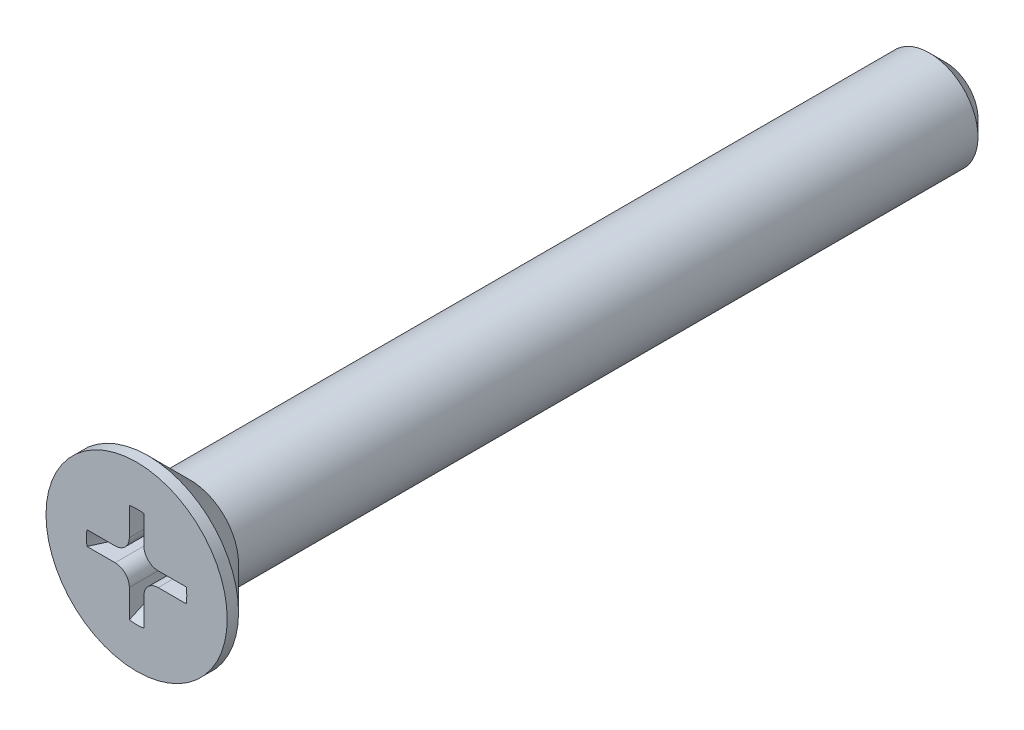
ISO-10303-21;
HEADER;
FILE_DESCRIPTION(('STEP AP214'),'2;1');
FILE_NAME('part.step','',(''),(''),'','','');
FILE_SCHEMA(('AUTOMOTIVE_DESIGN { 1 0 10303 214 1 1 1 1 }'));
ENDSEC;
DATA;
#1=APPLICATION_CONTEXT('core data for automotive mechanical design processes');
#2=APPLICATION_PROTOCOL_DEFINITION('international standard','automotive_design',2000,#1);
#3=PRODUCT_CONTEXT('',#1,'mechanical');
#4=PRODUCT('Part','Part','',(#3));
#5=PRODUCT_RELATED_PRODUCT_CATEGORY('part','',(#4));
#6=PRODUCT_DEFINITION_FORMATION('','',#4);
#7=PRODUCT_DEFINITION_CONTEXT('part definition',#1,'design');
#8=PRODUCT_DEFINITION('design','',#6,#7);
#9=PRODUCT_DEFINITION_SHAPE('','',#8);
#10=(LENGTH_UNIT() NAMED_UNIT(*) SI_UNIT(.MILLI.,.METRE.));
#11=(NAMED_UNIT(*) PLANE_ANGLE_UNIT() SI_UNIT($,.RADIAN.));
#12=(NAMED_UNIT(*) SI_UNIT($,.STERADIAN.) SOLID_ANGLE_UNIT());
#13=UNCERTAINTY_MEASURE_WITH_UNIT(LENGTH_MEASURE(1.E-05),#10,'distance_accuracy_value','');
#14=(GEOMETRIC_REPRESENTATION_CONTEXT(3) GLOBAL_UNCERTAINTY_ASSIGNED_CONTEXT((#13)) GLOBAL_UNIT_ASSIGNED_CONTEXT((#10,
#11,#12)) REPRESENTATION_CONTEXT('',''));
#15=CARTESIAN_POINT('',(0.,0.,0.));
#16=DIRECTION('',(0.,0.,1.));
#17=DIRECTION('',(1.,0.,0.));
#18=AXIS2_PLACEMENT_3D('',#15,#16,#17);
#19=CARTESIAN_POINT('',(0.,0.,1.65));
#20=DIRECTION('',(0.,0.,1.));
#21=DIRECTION('',(1.,0.,0.));
#22=AXIS2_PLACEMENT_3D('',#19,#20,#21);
#23=PLANE('',#22);
#24=CARTESIAN_POINT('',(0.,0.,1.65));
#25=DIRECTION('',(0.,0.,1.));
#26=DIRECTION('',(1.,0.,0.));
#27=AXIS2_PLACEMENT_3D('',#24,#25,#26);
#28=CIRCLE('',#27,2.8);
#29=CARTESIAN_POINT('',(2.8,0.,1.65));
#30=VERTEX_POINT('',#29);
#31=EDGE_CURVE('E60',#30,#30,#28,.T.);
#32=ORIENTED_EDGE('',*,*,#31,.T.);
#33=EDGE_LOOP('',(#32));
#34=FACE_BOUND('',#33,.T.);
#35=CARTESIAN_POINT('',(0.665,-0.665,1.65));
#36=DIRECTION('',(0.,0.,1.));
#37=DIRECTION('',(1.,0.,0.));
#38=AXIS2_PLACEMENT_3D('',#35,#36,#37);
#39=CIRCLE('',#38,0.44);
#40=CARTESIAN_POINT('',(0.665,-0.225,1.65));
#41=VERTEX_POINT('',#40);
#42=CARTESIAN_POINT('',(0.225,-0.665,1.65));
#43=VERTEX_POINT('',#42);
#44=EDGE_CURVE('E306',#41,#43,#39,.T.);
#45=ORIENTED_EDGE('',*,*,#44,.T.);
#46=DIRECTION('',(0.,-1.,0.));
#47=VECTOR('',#46,1.);
#48=CARTESIAN_POINT('',(0.225,-0.665,1.65));
#49=LINE('',#48,#47);
#50=CARTESIAN_POINT('',(0.225,-1.533582407306,1.65));
#51=VERTEX_POINT('',#50);
#52=EDGE_CURVE('E283',#43,#51,#49,.T.);
#53=ORIENTED_EDGE('',*,*,#52,.T.);
#54=CARTESIAN_POINT('',(0.,0.,1.65));
#55=DIRECTION('',(0.,0.,1.));
#56=DIRECTION('',(1.,0.,0.));
#57=AXIS2_PLACEMENT_3D('',#54,#55,#56);
#58=CIRCLE('',#57,1.55);
#59=CARTESIAN_POINT('',(0.,-1.55,1.65));
#60=VERTEX_POINT('',#59);
#61=EDGE_CURVE('E234',#60,#51,#58,.T.);
#62=ORIENTED_EDGE('',*,*,#61,.F.);
#63=CARTESIAN_POINT('',(0.,0.,1.65));
#64=DIRECTION('',(0.,0.,1.));
#65=DIRECTION('',(1.,0.,0.));
#66=AXIS2_PLACEMENT_3D('',#63,#64,#65);
#67=CIRCLE('',#66,1.55);
#68=CARTESIAN_POINT('',(-0.225,-1.533582407307,1.65));
#69=VERTEX_POINT('',#68);
#70=EDGE_CURVE('E284',#69,#60,#67,.T.);
#71=ORIENTED_EDGE('',*,*,#70,.F.);
#72=DIRECTION('',(0.,1.,0.));
#73=VECTOR('',#72,1.);
#74=CARTESIAN_POINT('',(-0.225,-1.55,1.65));
#75=LINE('',#74,#73);
#76=CARTESIAN_POINT('',(-0.225,-0.665,1.65));
#77=VERTEX_POINT('',#76);
#78=EDGE_CURVE('E221',#69,#77,#75,.T.);
#79=ORIENTED_EDGE('',*,*,#78,.T.);
#80=CARTESIAN_POINT('',(-0.665,-0.665,1.65));
#81=DIRECTION('',(0.,0.,1.));
#82=DIRECTION('',(1.,0.,0.));
#83=AXIS2_PLACEMENT_3D('',#80,#81,#82);
#84=CIRCLE('',#83,0.44);
#85=CARTESIAN_POINT('',(-0.665,-0.225,1.65));
#86=VERTEX_POINT('',#85);
#87=EDGE_CURVE('E218',#77,#86,#84,.T.);
#88=ORIENTED_EDGE('',*,*,#87,.T.);
#89=DIRECTION('',(-1.,0.,0.));
#90=VECTOR('',#89,1.);
#91=CARTESIAN_POINT('',(-0.665,-0.225,1.65));
#92=LINE('',#91,#90);
#93=CARTESIAN_POINT('',(-1.533582407307,-0.225,1.65));
#94=VERTEX_POINT('',#93);
#95=EDGE_CURVE('E222',#86,#94,#92,.T.);
#96=ORIENTED_EDGE('',*,*,#95,.T.);
#97=CARTESIAN_POINT('',(0.,0.,1.65));
#98=DIRECTION('',(0.,0.,1.));
#99=DIRECTION('',(1.,0.,0.));
#100=AXIS2_PLACEMENT_3D('',#97,#98,#99);
#101=CIRCLE('',#100,1.55);
#102=CARTESIAN_POINT('',(-1.55,0.,1.65));
#103=VERTEX_POINT('',#102);
#104=EDGE_CURVE('E272',#103,#94,#101,.T.);
#105=ORIENTED_EDGE('',*,*,#104,.F.);
#106=CARTESIAN_POINT('',(0.,0.,1.65));
#107=DIRECTION('',(0.,0.,1.));
#108=DIRECTION('',(1.,0.,0.));
#109=AXIS2_PLACEMENT_3D('',#106,#107,#108);
#110=CIRCLE('',#109,1.55);
#111=CARTESIAN_POINT('',(-1.533582407307,0.225,1.65));
#112=VERTEX_POINT('',#111);
#113=EDGE_CURVE('E262',#112,#103,#110,.T.);
#114=ORIENTED_EDGE('',*,*,#113,.F.);
#115=DIRECTION('',(1.,0.,0.));
#116=VECTOR('',#115,1.);
#117=CARTESIAN_POINT('',(-1.55,0.225,1.65));
#118=LINE('',#117,#116);
#119=CARTESIAN_POINT('',(-0.665,0.225,1.65));
#120=VERTEX_POINT('',#119);
#121=EDGE_CURVE('E278',#112,#120,#118,.T.);
#122=ORIENTED_EDGE('',*,*,#121,.T.);
#123=CARTESIAN_POINT('',(-0.665,0.665,1.65));
#124=DIRECTION('',(0.,0.,1.));
#125=DIRECTION('',(1.,0.,0.));
#126=AXIS2_PLACEMENT_3D('',#123,#124,#125);
#127=CIRCLE('',#126,0.44);
#128=CARTESIAN_POINT('',(-0.225,0.665,1.65));
#129=VERTEX_POINT('',#128);
#130=EDGE_CURVE('E291',#120,#129,#127,.T.);
#131=ORIENTED_EDGE('',*,*,#130,.T.);
#132=DIRECTION('',(0.,1.,0.));
#133=VECTOR('',#132,1.);
#134=CARTESIAN_POINT('',(-0.225,0.665,1.65));
#135=LINE('',#134,#133);
#136=CARTESIAN_POINT('',(-0.225,1.533582407307,1.65));
#137=VERTEX_POINT('',#136);
#138=EDGE_CURVE('E196',#129,#137,#135,.T.);
#139=ORIENTED_EDGE('',*,*,#138,.T.);
#140=CARTESIAN_POINT('',(0.,0.,1.65));
#141=DIRECTION('',(0.,0.,1.));
#142=DIRECTION('',(1.,0.,0.));
#143=AXIS2_PLACEMENT_3D('',#140,#141,#142);
#144=CIRCLE('',#143,1.55);
#145=CARTESIAN_POINT('',(0.,1.55,1.65));
#146=VERTEX_POINT('',#145);
#147=EDGE_CURVE('E186',#146,#137,#144,.T.);
#148=ORIENTED_EDGE('',*,*,#147,.F.);
#149=CARTESIAN_POINT('',(0.,0.,1.65));
#150=DIRECTION('',(0.,0.,1.));
#151=DIRECTION('',(1.,0.,0.));
#152=AXIS2_PLACEMENT_3D('',#149,#150,#151);
#153=CIRCLE('',#152,1.55);
#154=CARTESIAN_POINT('',(0.225,1.533582407307,1.65));
#155=VERTEX_POINT('',#154);
#156=EDGE_CURVE('E179',#155,#146,#153,.T.);
#157=ORIENTED_EDGE('',*,*,#156,.F.);
#158=DIRECTION('',(0.,-1.,0.));
#159=VECTOR('',#158,1.);
#160=CARTESIAN_POINT('',(0.225,1.55,1.65));
#161=LINE('',#160,#159);
#162=CARTESIAN_POINT('',(0.225,0.665,1.65));
#163=VERTEX_POINT('',#162);
#164=EDGE_CURVE('E183',#155,#163,#161,.T.);
#165=ORIENTED_EDGE('',*,*,#164,.T.);
#166=CARTESIAN_POINT('',(0.665,0.665,1.65));
#167=DIRECTION('',(0.,0.,1.));
#168=DIRECTION('',(1.,0.,0.));
#169=AXIS2_PLACEMENT_3D('',#166,#167,#168);
#170=CIRCLE('',#169,0.44);
#171=CARTESIAN_POINT('',(0.665,0.225,1.65));
#172=VERTEX_POINT('',#171);
#173=EDGE_CURVE('E197',#163,#172,#170,.T.);
#174=ORIENTED_EDGE('',*,*,#173,.T.);
#175=DIRECTION('',(1.,0.,0.));
#176=VECTOR('',#175,1.);
#177=CARTESIAN_POINT('',(0.665,0.225,1.65));
#178=LINE('',#177,#176);
#179=CARTESIAN_POINT('',(1.533582407306,0.225,1.65));
#180=VERTEX_POINT('',#179);
#181=EDGE_CURVE('E308',#172,#180,#178,.T.);
#182=ORIENTED_EDGE('',*,*,#181,.T.);
#183=CARTESIAN_POINT('',(0.,0.,1.65));
#184=DIRECTION('',(0.,0.,1.));
#185=DIRECTION('',(1.,0.,0.));
#186=AXIS2_PLACEMENT_3D('',#183,#184,#185);
#187=CIRCLE('',#186,1.55);
#188=CARTESIAN_POINT('',(1.55,0.,1.65));
#189=VERTEX_POINT('',#188);
#190=EDGE_CURVE('E238',#189,#180,#187,.T.);
#191=ORIENTED_EDGE('',*,*,#190,.F.);
#192=CARTESIAN_POINT('',(0.,0.,1.65));
#193=DIRECTION('',(0.,0.,1.));
#194=DIRECTION('',(1.,0.,0.));
#195=AXIS2_PLACEMENT_3D('',#192,#193,#194);
#196=CIRCLE('',#195,1.55);
#197=CARTESIAN_POINT('',(1.533582407306,-0.225,1.65));
#198=VERTEX_POINT('',#197);
#199=EDGE_CURVE('E236',#198,#189,#196,.T.);
#200=ORIENTED_EDGE('',*,*,#199,.F.);
#201=DIRECTION('',(-1.,0.,0.));
#202=VECTOR('',#201,1.);
#203=CARTESIAN_POINT('',(1.55,-0.225,1.65));
#204=LINE('',#203,#202);
#205=EDGE_CURVE('E302',#198,#41,#204,.T.);
#206=ORIENTED_EDGE('',*,*,#205,.T.);
#207=EDGE_LOOP('',(#45,#53,#62,#71,#79,#88,#96,#105,#114,#122,#131,#139,#148,#157,#165,#174,
#182,#191,#200,#206));
#208=FACE_BOUND('',#207,.T.);
#209=ADVANCED_FACE('F38',(#34,#208),#23,.T.);
#210=CARTESIAN_POINT('',(0.,0.,1.65));
#211=DIRECTION('',(0.,0.,-1.));
#212=DIRECTION('',(1.,0.,0.));
#213=AXIS2_PLACEMENT_3D('',#210,#211,#212);
#214=CYLINDRICAL_SURFACE('',#213,2.8);
#215=DIRECTION('',(0.,0.,-1.));
#216=VECTOR('',#215,1.);
#217=CARTESIAN_POINT('',(2.8,0.,1.65));
#218=LINE('',#217,#216);
#219=CARTESIAN_POINT('',(2.8,0.,1.3));
#220=VERTEX_POINT('',#219);
#221=EDGE_CURVE('E300',#30,#220,#218,.T.);
#222=ORIENTED_EDGE('',*,*,#221,.T.);
#223=CARTESIAN_POINT('',(0.,0.,1.3));
#224=DIRECTION('',(0.,0.,1.));
#225=DIRECTION('',(1.,0.,0.));
#226=AXIS2_PLACEMENT_3D('',#223,#224,#225);
#227=CIRCLE('',#226,2.8);
#228=EDGE_CURVE('E303',#220,#220,#227,.T.);
#229=ORIENTED_EDGE('',*,*,#228,.T.);
#230=ORIENTED_EDGE('',*,*,#221,.F.);
#231=ORIENTED_EDGE('',*,*,#31,.F.);
#232=EDGE_LOOP('',(#222,#229,#230,#231));
#233=FACE_BOUND('',#232,.T.);
#234=ADVANCED_FACE('F461',(#233),#214,.T.);
#235=CARTESIAN_POINT('',(1.55,-0.225,-0.35));
#236=DIRECTION('',(0.,-1.,0.));
#237=DIRECTION('',(0.,0.,-1.));
#238=AXIS2_PLACEMENT_3D('',#235,#236,#237);
#239=PLANE('',#238);
#240=DIRECTION('',(0.,0.,1.));
#241=VECTOR('',#240,1.);
#242=CARTESIAN_POINT('',(0.665,-0.225,-0.35));
#243=LINE('',#242,#241);
#244=CARTESIAN_POINT('',(0.665,-0.225,-0.25554435333));
#245=VERTEX_POINT('',#244);
#246=EDGE_CURVE('E254',#245,#41,#243,.T.);
#247=ORIENTED_EDGE('',*,*,#246,.T.);
#248=ORIENTED_EDGE('',*,*,#205,.F.);
#249=CARTESIAN_POINT('',(1.53358240722194,-0.225,1.64999999981109));
#250=CARTESIAN_POINT('',(0.935765735353057,-0.225,0.320821122288212));
#251=CARTESIAN_POINT('',(0.664999999996956,-0.225,-0.255544353336842));
#252=(BOUNDED_CURVE() B_SPLINE_CURVE(2,(#249,#250,#251),.UNSPECIFIED.,.F.,
.F.) B_SPLINE_CURVE_WITH_KNOTS((3,3),(0.,1.),
.UNSPECIFIED.) CURVE() GEOMETRIC_REPRESENTATION_ITEM() RATIONAL_B_SPLINE_CURVE((1.,
1.08385904705038,1.)) REPRESENTATION_ITEM(''));
#253=EDGE_CURVE('E247',#198,#245,#252,.T.);
#254=ORIENTED_EDGE('',*,*,#253,.T.);
#255=EDGE_LOOP('',(#247,#248,#254));
#256=FACE_BOUND('',#255,.T.);
#257=ADVANCED_FACE('F466',(#256),#239,.F.);
#258=CARTESIAN_POINT('',(0.665,-0.665,-0.35));
#259=DIRECTION('',(0.,0.,-1.));
#260=DIRECTION('',(1.,0.,0.));
#261=AXIS2_PLACEMENT_3D('',#258,#259,#260);
#262=CYLINDRICAL_SURFACE('',#261,0.44);
#263=CARTESIAN_POINT('',(0.665,-0.665,-0.35));
#264=DIRECTION('',(0.,0.,1.));
#265=DIRECTION('',(1.,0.,0.));
#266=AXIS2_PLACEMENT_3D('',#263,#264,#265);
#267=CIRCLE('',#266,0.44);
#268=CARTESIAN_POINT('',(0.619607132219,-0.227347754999,-0.35));
#269=VERTEX_POINT('',#268);
#270=CARTESIAN_POINT('',(0.227347754999,-0.619607132219,-0.35));
#271=VERTEX_POINT('',#270);
#272=EDGE_CURVE('E255',#269,#271,#267,.T.);
#273=ORIENTED_EDGE('',*,*,#272,.T.);
#274=CARTESIAN_POINT('',(0.227347754999,-0.619607132219,-0.35));
#275=CARTESIAN_POINT('',(0.226155909072,-0.631098233604,-0.326680269394));
#276=CARTESIAN_POINT('',(0.225380747892,-0.642491616551,-0.303127328583));
#277=CARTESIAN_POINT('',(0.225000000597,-0.653791617901,-0.279403075125));
#278=CARTESIAN_POINT('',(0.225,-0.665,-0.25554435333));
#279=(BOUNDED_CURVE() B_SPLINE_CURVE(4,(#274,#275,#276,#277,#278),.UNSPECIFIED.,.F.,
.F.) B_SPLINE_CURVE_WITH_KNOTS((5,5),(0.,1.),
.UNSPECIFIED.) CURVE() GEOMETRIC_REPRESENTATION_ITEM() RATIONAL_B_SPLINE_CURVE((1.,1.,1.,1.,1.)) REPRESENTATION_ITEM(''));
#280=CARTESIAN_POINT('',(0.225,-0.665,-0.25554435333));
#281=VERTEX_POINT('',#280);
#282=EDGE_CURVE('E314',#271,#281,#279,.T.);
#283=ORIENTED_EDGE('',*,*,#282,.T.);
#284=DIRECTION('',(0.,0.,1.));
#285=VECTOR('',#284,1.);
#286=CARTESIAN_POINT('',(0.225,-0.665,-0.35));
#287=LINE('',#286,#285);
#288=EDGE_CURVE('E311',#281,#43,#287,.T.);
#289=ORIENTED_EDGE('',*,*,#288,.T.);
#290=ORIENTED_EDGE('',*,*,#44,.F.);
#291=ORIENTED_EDGE('',*,*,#246,.F.);
#292=CARTESIAN_POINT('',(0.665,-0.225,-0.25554435333));
#293=CARTESIAN_POINT('',(0.653791617945,-0.225000000597,-0.279403075031));
#294=CARTESIAN_POINT('',(0.642491616753,-0.22538074788,-0.303127328164));
#295=CARTESIAN_POINT('',(0.631098233614,-0.22615590907,-0.326680269374));
#296=CARTESIAN_POINT('',(0.619607132219,-0.227347754999,-0.35));
#297=(BOUNDED_CURVE() B_SPLINE_CURVE(4,(#292,#293,#294,#295,#296),.UNSPECIFIED.,.F.,
.F.) B_SPLINE_CURVE_WITH_KNOTS((5,5),(0.,1.),
.UNSPECIFIED.) CURVE() GEOMETRIC_REPRESENTATION_ITEM() RATIONAL_B_SPLINE_CURVE((1.,1.,1.,1.,1.)) REPRESENTATION_ITEM(''));
#298=EDGE_CURVE('E295',#245,#269,#297,.T.);
#299=ORIENTED_EDGE('',*,*,#298,.T.);
#300=EDGE_LOOP('',(#273,#283,#289,#290,#291,#299));
#301=FACE_BOUND('',#300,.T.);
#302=ADVANCED_FACE('F432',(#301),#262,.T.);
#303=CARTESIAN_POINT('',(0.225,-0.665,-0.35));
#304=DIRECTION('',(1.,0.,0.));
#305=DIRECTION('',(0.,1.,0.));
#306=AXIS2_PLACEMENT_3D('',#303,#304,#305);
#307=PLANE('',#306);
#308=ORIENTED_EDGE('',*,*,#52,.F.);
#309=ORIENTED_EDGE('',*,*,#288,.F.);
#310=CARTESIAN_POINT('',(0.225,-0.664999999999369,-0.255544353328584));
#311=CARTESIAN_POINT('',(0.225,-0.935765735371318,0.320821122331559));
#312=CARTESIAN_POINT('',(0.225,-1.5335824073049,1.65000000000246));
#313=(BOUNDED_CURVE() B_SPLINE_CURVE(2,(#310,#311,#312),.UNSPECIFIED.,.F.,
.F.) B_SPLINE_CURVE_WITH_KNOTS((3,3),(0.,1.),
.UNSPECIFIED.) CURVE() GEOMETRIC_REPRESENTATION_ITEM() RATIONAL_B_SPLINE_CURVE((1.,
1.08385904706071,1.)) REPRESENTATION_ITEM(''));
#314=EDGE_CURVE('E287',#281,#51,#313,.T.);
#315=ORIENTED_EDGE('',*,*,#314,.T.);
#316=EDGE_LOOP('',(#308,#309,#315));
#317=FACE_BOUND('',#316,.T.);
#318=ADVANCED_FACE('F512',(#317),#307,.F.);
#319=CARTESIAN_POINT('',(0.,0.,-0.35));
#320=DIRECTION('',(0.,0.,1.));
#321=DIRECTION('',(1.,0.,0.));
#322=AXIS2_PLACEMENT_3D('',#319,#320,#321);
#323=CONICAL_SURFACE('',#322,0.66,0.418688151438);
#324=ORIENTED_EDGE('',*,*,#282,.F.);
#325=CARTESIAN_POINT('',(0.,0.,-0.35));
#326=DIRECTION('',(0.,0.,1.));
#327=DIRECTION('',(1.,0.,0.));
#328=AXIS2_PLACEMENT_3D('',#325,#326,#327);
#329=CIRCLE('',#328,0.66);
#330=CARTESIAN_POINT('',(-0.227347754999,-0.619607132219,-0.35));
#331=VERTEX_POINT('',#330);
#332=EDGE_CURVE('E280',#331,#271,#329,.T.);
#333=ORIENTED_EDGE('',*,*,#332,.F.);
#334=CARTESIAN_POINT('',(-0.225,-0.665,-0.25554435333));
#335=CARTESIAN_POINT('',(-0.225000000614,-0.653791347239,-0.279403651256));
#336=CARTESIAN_POINT('',(-0.225380757612,-0.642491610553,-0.303127322771));
#337=CARTESIAN_POINT('',(-0.22615591599,-0.631098166895,-0.32668040477));
#338=CARTESIAN_POINT('',(-0.227347754999,-0.619607132219,-0.35));
#339=(BOUNDED_CURVE() B_SPLINE_CURVE(4,(#334,#335,#336,#337,#338),.UNSPECIFIED.,.F.,
.F.) B_SPLINE_CURVE_WITH_KNOTS((5,5),(0.,1.),
.UNSPECIFIED.) CURVE() GEOMETRIC_REPRESENTATION_ITEM() RATIONAL_B_SPLINE_CURVE((1.,1.,1.,1.,1.)) REPRESENTATION_ITEM(''));
#340=CARTESIAN_POINT('',(-0.225,-0.665,-0.25554435333));
#341=VERTEX_POINT('',#340);
#342=EDGE_CURVE('E240',#341,#331,#339,.T.);
#343=ORIENTED_EDGE('',*,*,#342,.F.);
#344=CARTESIAN_POINT('',(-0.225,-1.53358240731633,1.65000000002096));
#345=CARTESIAN_POINT('',(-0.225,-0.935765735371249,0.320821122326936));
#346=CARTESIAN_POINT('',(-0.225,-0.664999999996956,-0.255544353336842));
#347=(BOUNDED_CURVE() B_SPLINE_CURVE(2,(#344,#345,#346),.UNSPECIFIED.,.F.,
.F.) B_SPLINE_CURVE_WITH_KNOTS((3,3),(0.,1.),
.UNSPECIFIED.) CURVE() GEOMETRIC_REPRESENTATION_ITEM() RATIONAL_B_SPLINE_CURVE((1.,
1.08385904706299,1.)) REPRESENTATION_ITEM(''));
#348=EDGE_CURVE('E235',#69,#341,#347,.T.);
#349=ORIENTED_EDGE('',*,*,#348,.F.);
#350=ORIENTED_EDGE('',*,*,#70,.T.);
#351=ORIENTED_EDGE('',*,*,#61,.T.);
#352=ORIENTED_EDGE('',*,*,#314,.F.);
#353=EDGE_LOOP('',(#324,#333,#343,#349,#350,#351,#352));
#354=FACE_BOUND('',#353,.T.);
#355=ADVANCED_FACE('F520',(#354),#323,.F.);
#356=CARTESIAN_POINT('',(-0.225,-1.55,-0.35));
#357=DIRECTION('',(-1.,0.,0.));
#358=DIRECTION('',(0.,0.,1.));
#359=AXIS2_PLACEMENT_3D('',#356,#357,#358);
#360=PLANE('',#359);
#361=DIRECTION('',(0.,0.,1.));
#362=VECTOR('',#361,1.);
#363=CARTESIAN_POINT('',(-0.225,-0.665,-0.35));
#364=LINE('',#363,#362);
#365=EDGE_CURVE('E228',#341,#77,#364,.T.);
#366=ORIENTED_EDGE('',*,*,#365,.T.);
#367=ORIENTED_EDGE('',*,*,#78,.F.);
#368=ORIENTED_EDGE('',*,*,#348,.T.);
#369=EDGE_LOOP('',(#366,#367,#368));
#370=FACE_BOUND('',#369,.T.);
#371=ADVANCED_FACE('F588',(#370),#360,.F.);
#372=CARTESIAN_POINT('',(-0.665,-0.665,-0.35));
#373=DIRECTION('',(0.,0.,-1.));
#374=DIRECTION('',(1.,0.,0.));
#375=AXIS2_PLACEMENT_3D('',#372,#373,#374);
#376=CYLINDRICAL_SURFACE('',#375,0.44);
#377=CARTESIAN_POINT('',(-0.665,-0.665,-0.35));
#378=DIRECTION('',(0.,0.,1.));
#379=DIRECTION('',(1.,0.,0.));
#380=AXIS2_PLACEMENT_3D('',#377,#378,#379);
#381=CIRCLE('',#380,0.44);
#382=CARTESIAN_POINT('',(-0.619607132219,-0.227347754999,-0.35));
#383=VERTEX_POINT('',#382);
#384=EDGE_CURVE('E322',#331,#383,#381,.T.);
#385=ORIENTED_EDGE('',*,*,#384,.T.);
#386=CARTESIAN_POINT('',(-0.619607132219,-0.227347754999,-0.35));
#387=CARTESIAN_POINT('',(-0.631098233755,-0.226155909056,-0.326680269086));
#388=CARTESIAN_POINT('',(-0.642491616684,-0.225380747871,-0.303127328319));
#389=CARTESIAN_POINT('',(-0.653791618056,-0.225000000614,-0.279403074781));
#390=CARTESIAN_POINT('',(-0.665,-0.225,-0.25554435333));
#391=(BOUNDED_CURVE() B_SPLINE_CURVE(4,(#386,#387,#388,#389,#390),.UNSPECIFIED.,.F.,
.F.) B_SPLINE_CURVE_WITH_KNOTS((5,5),(0.,1.),
.UNSPECIFIED.) CURVE() GEOMETRIC_REPRESENTATION_ITEM() RATIONAL_B_SPLINE_CURVE((1.,1.,1.,1.,1.)) REPRESENTATION_ITEM(''));
#392=CARTESIAN_POINT('',(-0.665,-0.225,-0.25554435333));
#393=VERTEX_POINT('',#392);
#394=EDGE_CURVE('E372',#383,#393,#391,.T.);
#395=ORIENTED_EDGE('',*,*,#394,.T.);
#396=DIRECTION('',(0.,0.,1.));
#397=VECTOR('',#396,1.);
#398=CARTESIAN_POINT('',(-0.665,-0.225,-0.35));
#399=LINE('',#398,#397);
#400=EDGE_CURVE('E245',#393,#86,#399,.T.);
#401=ORIENTED_EDGE('',*,*,#400,.T.);
#402=ORIENTED_EDGE('',*,*,#87,.F.);
#403=ORIENTED_EDGE('',*,*,#365,.F.);
#404=ORIENTED_EDGE('',*,*,#342,.T.);
#405=EDGE_LOOP('',(#385,#395,#401,#402,#403,#404));
#406=FACE_BOUND('',#405,.T.);
#407=ADVANCED_FACE('F531',(#406),#376,.T.);
#408=CARTESIAN_POINT('',(-0.665,-0.225,-0.35));
#409=DIRECTION('',(0.,-1.,0.));
#410=DIRECTION('',(0.,0.,-1.));
#411=AXIS2_PLACEMENT_3D('',#408,#409,#410);
#412=PLANE('',#411);
#413=ORIENTED_EDGE('',*,*,#95,.F.);
#414=ORIENTED_EDGE('',*,*,#400,.F.);
#415=CARTESIAN_POINT('',(-0.665000000000083,-0.225,-0.255544353330185));
#416=CARTESIAN_POINT('',(-0.935765735372384,-0.225,0.320821122329629));
#417=CARTESIAN_POINT('',(-1.53358240730695,-0.225,1.65000000000011));
#418=(BOUNDED_CURVE() B_SPLINE_CURVE(2,(#415,#416,#417),.UNSPECIFIED.,.F.,
.F.) B_SPLINE_CURVE_WITH_KNOTS((3,3),(0.,1.),
.UNSPECIFIED.) CURVE() GEOMETRIC_REPRESENTATION_ITEM() RATIONAL_B_SPLINE_CURVE((1.,
1.08385904706077,1.)) REPRESENTATION_ITEM(''));
#419=EDGE_CURVE('E246',#393,#94,#418,.T.);
#420=ORIENTED_EDGE('',*,*,#419,.T.);
#421=EDGE_LOOP('',(#413,#414,#420));
#422=FACE_BOUND('',#421,.T.);
#423=ADVANCED_FACE('F525',(#422),#412,.F.);
#424=CARTESIAN_POINT('',(0.,0.,-0.35));
#425=DIRECTION('',(0.,0.,1.));
#426=DIRECTION('',(1.,0.,0.));
#427=AXIS2_PLACEMENT_3D('',#424,#425,#426);
#428=CONICAL_SURFACE('',#427,0.66,0.418688151438);
#429=ORIENTED_EDGE('',*,*,#104,.T.);
#430=ORIENTED_EDGE('',*,*,#419,.F.);
#431=ORIENTED_EDGE('',*,*,#394,.F.);
#432=CARTESIAN_POINT('',(0.,0.,-0.35));
#433=DIRECTION('',(0.,0.,1.));
#434=DIRECTION('',(1.,0.,0.));
#435=AXIS2_PLACEMENT_3D('',#432,#433,#434);
#436=CIRCLE('',#435,0.66);
#437=CARTESIAN_POINT('',(-0.619607132219,0.227347754999,-0.35));
#438=VERTEX_POINT('',#437);
#439=EDGE_CURVE('E360',#438,#383,#436,.T.);
#440=ORIENTED_EDGE('',*,*,#439,.F.);
#441=CARTESIAN_POINT('',(-0.665,0.225,-0.25554435333));
#442=CARTESIAN_POINT('',(-0.653791617831,0.225000000597,-0.279403075273));
#443=CARTESIAN_POINT('',(-0.642491616492,0.225380747894,-0.303127328708));
#444=CARTESIAN_POINT('',(-0.631098233528,0.226155909079,-0.326680269547));
#445=CARTESIAN_POINT('',(-0.619607132219,0.227347754999,-0.35));
#446=(BOUNDED_CURVE() B_SPLINE_CURVE(4,(#441,#442,#443,#444,#445),.UNSPECIFIED.,.F.,
.F.) B_SPLINE_CURVE_WITH_KNOTS((5,5),(0.,1.),
.UNSPECIFIED.) CURVE() GEOMETRIC_REPRESENTATION_ITEM() RATIONAL_B_SPLINE_CURVE((1.,1.,1.,1.,1.)) REPRESENTATION_ITEM(''));
#447=CARTESIAN_POINT('',(-0.665,0.225,-0.25554435333));
#448=VERTEX_POINT('',#447);
#449=EDGE_CURVE('E406',#448,#438,#446,.T.);
#450=ORIENTED_EDGE('',*,*,#449,.F.);
#451=CARTESIAN_POINT('',(-1.53358240731633,0.225,1.65000000002096));
#452=CARTESIAN_POINT('',(-0.935765735371249,0.225,0.320821122326936));
#453=CARTESIAN_POINT('',(-0.664999999996956,0.225,-0.255544353336842));
#454=(BOUNDED_CURVE() B_SPLINE_CURVE(2,(#451,#452,#453),.UNSPECIFIED.,.F.,
.F.) B_SPLINE_CURVE_WITH_KNOTS((3,3),(0.,1.),
.UNSPECIFIED.) CURVE() GEOMETRIC_REPRESENTATION_ITEM() RATIONAL_B_SPLINE_CURVE((1.,
1.08385904706299,1.)) REPRESENTATION_ITEM(''));
#455=EDGE_CURVE('E263',#112,#448,#454,.T.);
#456=ORIENTED_EDGE('',*,*,#455,.F.);
#457=ORIENTED_EDGE('',*,*,#113,.T.);
#458=EDGE_LOOP('',(#429,#430,#431,#440,#450,#456,#457));
#459=FACE_BOUND('',#458,.T.);
#460=ADVANCED_FACE('F530',(#459),#428,.F.);
#461=CARTESIAN_POINT('',(-1.55,0.225,-0.35));
#462=DIRECTION('',(0.,1.,0.));
#463=DIRECTION('',(1.,0.,0.));
#464=AXIS2_PLACEMENT_3D('',#461,#462,#463);
#465=PLANE('',#464);
#466=DIRECTION('',(0.,0.,1.));
#467=VECTOR('',#466,1.);
#468=CARTESIAN_POINT('',(-0.665,0.225,-0.35));
#469=LINE('',#468,#467);
#470=EDGE_CURVE('E256',#448,#120,#469,.T.);
#471=ORIENTED_EDGE('',*,*,#470,.T.);
#472=ORIENTED_EDGE('',*,*,#121,.F.);
#473=ORIENTED_EDGE('',*,*,#455,.T.);
#474=EDGE_LOOP('',(#471,#472,#473));
#475=FACE_BOUND('',#474,.T.);
#476=ADVANCED_FACE('F536',(#475),#465,.F.);
#477=CARTESIAN_POINT('',(-0.665,0.665,-0.35));
#478=DIRECTION('',(0.,0.,-1.));
#479=DIRECTION('',(1.,0.,0.));
#480=AXIS2_PLACEMENT_3D('',#477,#478,#479);
#481=CYLINDRICAL_SURFACE('',#480,0.44);
#482=CARTESIAN_POINT('',(-0.665,0.665,-0.35));
#483=DIRECTION('',(0.,0.,1.));
#484=DIRECTION('',(1.,0.,0.));
#485=AXIS2_PLACEMENT_3D('',#482,#483,#484);
#486=CIRCLE('',#485,0.44);
#487=CARTESIAN_POINT('',(-0.227347754999,0.619607132219,-0.35));
#488=VERTEX_POINT('',#487);
#489=EDGE_CURVE('E336',#438,#488,#486,.T.);
#490=ORIENTED_EDGE('',*,*,#489,.T.);
#491=CARTESIAN_POINT('',(-0.227347754999,0.619607132219,-0.35));
#492=CARTESIAN_POINT('',(-0.22615590908,0.631098233523,-0.326680269558));
#493=CARTESIAN_POINT('',(-0.225380747943,0.642491616488,-0.303127328518));
#494=CARTESIAN_POINT('',(-0.225000000597,0.653791617825,-0.279403075287));
#495=CARTESIAN_POINT('',(-0.225,0.665,-0.25554435333));
#496=(BOUNDED_CURVE() B_SPLINE_CURVE(4,(#491,#492,#493,#494,#495),.UNSPECIFIED.,.F.,
.F.) B_SPLINE_CURVE_WITH_KNOTS((5,5),(0.,1.),
.UNSPECIFIED.) CURVE() GEOMETRIC_REPRESENTATION_ITEM() RATIONAL_B_SPLINE_CURVE((1.,1.,1.,1.,1.)) REPRESENTATION_ITEM(''));
#497=CARTESIAN_POINT('',(-0.225,0.665,-0.25554435333));
#498=VERTEX_POINT('',#497);
#499=EDGE_CURVE('E339',#488,#498,#496,.T.);
#500=ORIENTED_EDGE('',*,*,#499,.T.);
#501=DIRECTION('',(0.,0.,1.));
#502=VECTOR('',#501,1.);
#503=CARTESIAN_POINT('',(-0.225,0.665,-0.35));
#504=LINE('',#503,#502);
#505=EDGE_CURVE('E379',#498,#129,#504,.T.);
#506=ORIENTED_EDGE('',*,*,#505,.T.);
#507=ORIENTED_EDGE('',*,*,#130,.F.);
#508=ORIENTED_EDGE('',*,*,#470,.F.);
#509=ORIENTED_EDGE('',*,*,#449,.T.);
#510=EDGE_LOOP('',(#490,#500,#506,#507,#508,#509));
#511=FACE_BOUND('',#510,.T.);
#512=ADVANCED_FACE('F473',(#511),#481,.T.);
#513=CARTESIAN_POINT('',(-0.225,0.665,-0.35));
#514=DIRECTION('',(-1.,0.,0.));
#515=DIRECTION('',(0.,0.,1.));
#516=AXIS2_PLACEMENT_3D('',#513,#514,#515);
#517=PLANE('',#516);
#518=ORIENTED_EDGE('',*,*,#138,.F.);
#519=ORIENTED_EDGE('',*,*,#505,.F.);
#520=CARTESIAN_POINT('',(-0.225,0.665000000000083,-0.255544353330185));
#521=CARTESIAN_POINT('',(-0.225,0.935765735372384,0.320821122329629));
#522=CARTESIAN_POINT('',(-0.225,1.53358240730695,1.65000000000011));
#523=(BOUNDED_CURVE() B_SPLINE_CURVE(2,(#520,#521,#522),.UNSPECIFIED.,.F.,
.F.) B_SPLINE_CURVE_WITH_KNOTS((3,3),(0.,1.),
.UNSPECIFIED.) CURVE() GEOMETRIC_REPRESENTATION_ITEM() RATIONAL_B_SPLINE_CURVE((1.,
1.08385904706077,1.)) REPRESENTATION_ITEM(''));
#524=EDGE_CURVE('E217',#498,#137,#523,.T.);
#525=ORIENTED_EDGE('',*,*,#524,.T.);
#526=EDGE_LOOP('',(#518,#519,#525));
#527=FACE_BOUND('',#526,.T.);
#528=ADVANCED_FACE('F471',(#527),#517,.F.);
#529=CARTESIAN_POINT('',(0.,0.,-0.35));
#530=DIRECTION('',(0.,0.,1.));
#531=DIRECTION('',(1.,0.,0.));
#532=AXIS2_PLACEMENT_3D('',#529,#530,#531);
#533=CONICAL_SURFACE('',#532,0.66,0.418688151438);
#534=ORIENTED_EDGE('',*,*,#147,.T.);
#535=ORIENTED_EDGE('',*,*,#524,.F.);
#536=ORIENTED_EDGE('',*,*,#499,.F.);
#537=CARTESIAN_POINT('',(0.,0.,-0.35));
#538=DIRECTION('',(0.,0.,1.));
#539=DIRECTION('',(1.,0.,0.));
#540=AXIS2_PLACEMENT_3D('',#537,#538,#539);
#541=CIRCLE('',#540,0.66);
#542=CARTESIAN_POINT('',(0.227347754999,0.619607132219,-0.35));
#543=VERTEX_POINT('',#542);
#544=EDGE_CURVE('E354',#543,#488,#541,.T.);
#545=ORIENTED_EDGE('',*,*,#544,.F.);
#546=CARTESIAN_POINT('',(0.225,0.665,-0.25554435333));
#547=CARTESIAN_POINT('',(0.225000000597,0.653791617868,-0.279403075196));
#548=CARTESIAN_POINT('',(0.22538074789,0.642491616564,-0.303127328557));
#549=CARTESIAN_POINT('',(0.226155909076,0.631098233561,-0.32668026948));
#550=CARTESIAN_POINT('',(0.227347754999,0.619607132219,-0.35));
#551=(BOUNDED_CURVE() B_SPLINE_CURVE(4,(#546,#547,#548,#549,#550),.UNSPECIFIED.,.F.,
.F.) B_SPLINE_CURVE_WITH_KNOTS((5,5),(0.,1.),
.UNSPECIFIED.) CURVE() GEOMETRIC_REPRESENTATION_ITEM() RATIONAL_B_SPLINE_CURVE((1.,1.,1.,1.,1.)) REPRESENTATION_ITEM(''));
#552=CARTESIAN_POINT('',(0.225,0.665,-0.25554435333));
#553=VERTEX_POINT('',#552);
#554=EDGE_CURVE('E201',#553,#543,#551,.T.);
#555=ORIENTED_EDGE('',*,*,#554,.F.);
#556=CARTESIAN_POINT('',(0.225,1.53358240731633,1.65000000002096));
#557=CARTESIAN_POINT('',(0.225,0.935765735371249,0.320821122326936));
#558=CARTESIAN_POINT('',(0.225,0.664999999996956,-0.255544353336842));
#559=(BOUNDED_CURVE() B_SPLINE_CURVE(2,(#556,#557,#558),.UNSPECIFIED.,.F.,
.F.) B_SPLINE_CURVE_WITH_KNOTS((3,3),(0.,1.),
.UNSPECIFIED.) CURVE() GEOMETRIC_REPRESENTATION_ITEM() RATIONAL_B_SPLINE_CURVE((1.,
1.08385904706299,1.)) REPRESENTATION_ITEM(''));
#560=EDGE_CURVE('E194',#155,#553,#559,.T.);
#561=ORIENTED_EDGE('',*,*,#560,.F.);
#562=ORIENTED_EDGE('',*,*,#156,.T.);
#563=EDGE_LOOP('',(#534,#535,#536,#545,#555,#561,#562));
#564=FACE_BOUND('',#563,.T.);
#565=ADVANCED_FACE('F199',(#564),#533,.F.);
#566=CARTESIAN_POINT('',(0.225,1.55,-0.35));
#567=DIRECTION('',(1.,0.,0.));
#568=DIRECTION('',(0.,1.,0.));
#569=AXIS2_PLACEMENT_3D('',#566,#567,#568);
#570=PLANE('',#569);
#571=DIRECTION('',(0.,0.,1.));
#572=VECTOR('',#571,1.);
#573=CARTESIAN_POINT('',(0.225,0.665,-0.35));
#574=LINE('',#573,#572);
#575=EDGE_CURVE('E189',#553,#163,#574,.T.);
#576=ORIENTED_EDGE('',*,*,#575,.T.);
#577=ORIENTED_EDGE('',*,*,#164,.F.);
#578=ORIENTED_EDGE('',*,*,#560,.T.);
#579=EDGE_LOOP('',(#576,#577,#578));
#580=FACE_BOUND('',#579,.T.);
#581=ADVANCED_FACE('F193',(#580),#570,.F.);
#582=CARTESIAN_POINT('',(0.665,0.665,-0.35));
#583=DIRECTION('',(0.,0.,-1.));
#584=DIRECTION('',(1.,0.,0.));
#585=AXIS2_PLACEMENT_3D('',#582,#583,#584);
#586=CYLINDRICAL_SURFACE('',#585,0.44);
#587=CARTESIAN_POINT('',(0.665,0.665,-0.35));
#588=DIRECTION('',(0.,0.,1.));
#589=DIRECTION('',(1.,0.,0.));
#590=AXIS2_PLACEMENT_3D('',#587,#588,#589);
#591=CIRCLE('',#590,0.44);
#592=CARTESIAN_POINT('',(0.619607132219,0.227347754999,-0.35));
#593=VERTEX_POINT('',#592);
#594=EDGE_CURVE('E202',#543,#593,#591,.T.);
#595=ORIENTED_EDGE('',*,*,#594,.T.);
#596=CARTESIAN_POINT('',(0.619607132219,0.227347754999,-0.35));
#597=CARTESIAN_POINT('',(0.631098233547,0.226155909077,-0.326680269509));
#598=CARTESIAN_POINT('',(0.642491616492,0.225380747894,-0.303127328708));
#599=CARTESIAN_POINT('',(0.653791617848,0.225000000597,-0.279403075237));
#600=CARTESIAN_POINT('',(0.665,0.225,-0.25554435333));
#601=(BOUNDED_CURVE() B_SPLINE_CURVE(4,(#596,#597,#598,#599,#600),.UNSPECIFIED.,.F.,
.F.) B_SPLINE_CURVE_WITH_KNOTS((5,5),(0.,1.),
.UNSPECIFIED.) CURVE() GEOMETRIC_REPRESENTATION_ITEM() RATIONAL_B_SPLINE_CURVE((1.,1.,1.,1.,1.)) REPRESENTATION_ITEM(''));
#602=CARTESIAN_POINT('',(0.665,0.225,-0.25554435333));
#603=VERTEX_POINT('',#602);
#604=EDGE_CURVE('E206',#593,#603,#601,.T.);
#605=ORIENTED_EDGE('',*,*,#604,.T.);
#606=DIRECTION('',(0.,0.,1.));
#607=VECTOR('',#606,1.);
#608=CARTESIAN_POINT('',(0.665,0.225,-0.35));
#609=LINE('',#608,#607);
#610=EDGE_CURVE('E227',#603,#172,#609,.T.);
#611=ORIENTED_EDGE('',*,*,#610,.T.);
#612=ORIENTED_EDGE('',*,*,#173,.F.);
#613=ORIENTED_EDGE('',*,*,#575,.F.);
#614=ORIENTED_EDGE('',*,*,#554,.T.);
#615=EDGE_LOOP('',(#595,#605,#611,#612,#613,#614));
#616=FACE_BOUND('',#615,.T.);
#617=ADVANCED_FACE('F447',(#616),#586,.T.);
#618=CARTESIAN_POINT('',(0.665,0.225,-0.35));
#619=DIRECTION('',(0.,1.,0.));
#620=DIRECTION('',(1.,0.,0.));
#621=AXIS2_PLACEMENT_3D('',#618,#619,#620);
#622=PLANE('',#621);
#623=ORIENTED_EDGE('',*,*,#181,.F.);
#624=ORIENTED_EDGE('',*,*,#610,.F.);
#625=CARTESIAN_POINT('',(0.665000000000083,0.225,-0.255544353330185));
#626=CARTESIAN_POINT('',(0.935765735372278,0.225,0.320821122329405));
#627=CARTESIAN_POINT('',(1.53358240730645,0.225,1.64999999999899));
#628=(BOUNDED_CURVE() B_SPLINE_CURVE(2,(#625,#626,#627),.UNSPECIFIED.,.F.,
.F.) B_SPLINE_CURVE_WITH_KNOTS((3,3),(0.,1.),
.UNSPECIFIED.) CURVE() GEOMETRIC_REPRESENTATION_ITEM() RATIONAL_B_SPLINE_CURVE((1.,
1.08385904706095,1.)) REPRESENTATION_ITEM(''));
#629=EDGE_CURVE('E266',#603,#180,#628,.T.);
#630=ORIENTED_EDGE('',*,*,#629,.T.);
#631=EDGE_LOOP('',(#623,#624,#630));
#632=FACE_BOUND('',#631,.T.);
#633=ADVANCED_FACE('F449',(#632),#622,.F.);
#634=CARTESIAN_POINT('',(0.,0.,-0.35));
#635=DIRECTION('',(0.,0.,1.));
#636=DIRECTION('',(1.,0.,0.));
#637=AXIS2_PLACEMENT_3D('',#634,#635,#636);
#638=CONICAL_SURFACE('',#637,0.66,0.418688151438);
#639=ORIENTED_EDGE('',*,*,#629,.F.);
#640=ORIENTED_EDGE('',*,*,#604,.F.);
#641=CARTESIAN_POINT('',(0.,0.,-0.35));
#642=DIRECTION('',(0.,0.,1.));
#643=DIRECTION('',(1.,0.,0.));
#644=AXIS2_PLACEMENT_3D('',#641,#642,#643);
#645=CIRCLE('',#644,0.66);
#646=CARTESIAN_POINT('',(0.66,0.,-0.35));
#647=VERTEX_POINT('',#646);
#648=EDGE_CURVE('E352',#647,#593,#645,.T.);
#649=ORIENTED_EDGE('',*,*,#648,.F.);
#650=DIRECTION('',(0.406562268123091,0.,0.913623074434204));
#651=VECTOR('',#650,1.);
#652=CARTESIAN_POINT('',(0.66,0.,-0.35));
#653=LINE('',#652,#651);
#654=EDGE_CURVE('E264',#647,#189,#653,.T.);
#655=ORIENTED_EDGE('',*,*,#654,.T.);
#656=ORIENTED_EDGE('',*,*,#190,.T.);
#657=EDGE_LOOP('',(#639,#640,#649,#655,#656));
#658=FACE_BOUND('',#657,.T.);
#659=ADVANCED_FACE('F445',(#658),#638,.F.);
#660=CARTESIAN_POINT('',(0.,0.,-0.35));
#661=DIRECTION('',(0.,0.,1.));
#662=DIRECTION('',(1.,0.,0.));
#663=AXIS2_PLACEMENT_3D('',#660,#661,#662);
#664=CONICAL_SURFACE('',#663,0.66,0.418688151438);
#665=CARTESIAN_POINT('',(0.,0.,-0.35));
#666=DIRECTION('',(0.,0.,1.));
#667=DIRECTION('',(1.,0.,0.));
#668=AXIS2_PLACEMENT_3D('',#665,#666,#667);
#669=CIRCLE('',#668,0.66);
#670=EDGE_CURVE('E212',#269,#647,#669,.T.);
#671=ORIENTED_EDGE('',*,*,#670,.F.);
#672=ORIENTED_EDGE('',*,*,#298,.F.);
#673=ORIENTED_EDGE('',*,*,#253,.F.);
#674=ORIENTED_EDGE('',*,*,#199,.T.);
#675=ORIENTED_EDGE('',*,*,#654,.F.);
#676=EDGE_LOOP('',(#671,#672,#673,#674,#675));
#677=FACE_BOUND('',#676,.T.);
#678=ADVANCED_FACE('F441',(#677),#664,.F.);
#679=CARTESIAN_POINT('',(0.,0.,1.3));
#680=DIRECTION('',(0.,0.,1.));
#681=DIRECTION('',(1.,0.,0.));
#682=AXIS2_PLACEMENT_3D('',#679,#680,#681);
#683=CONICAL_SURFACE('',#682,2.8,0.785398163397);
#684=DIRECTION('',(-0.707106781186548,0.,-0.707106781186548));
#685=VECTOR('',#684,1.);
#686=CARTESIAN_POINT('',(2.8,0.,1.3));
#687=LINE('',#686,#685);
#688=CARTESIAN_POINT('',(1.5,0.,0.));
#689=VERTEX_POINT('',#688);
#690=EDGE_CURVE('E239',#220,#689,#687,.T.);
#691=ORIENTED_EDGE('',*,*,#690,.T.);
#692=CARTESIAN_POINT('',(0.,0.,0.));
#693=DIRECTION('',(0.,0.,1.));
#694=DIRECTION('',(1.,0.,0.));
#695=AXIS2_PLACEMENT_3D('',#692,#693,#694);
#696=CIRCLE('',#695,1.5);
#697=EDGE_CURVE('E358',#689,#689,#696,.T.);
#698=ORIENTED_EDGE('',*,*,#697,.T.);
#699=ORIENTED_EDGE('',*,*,#690,.F.);
#700=ORIENTED_EDGE('',*,*,#228,.F.);
#701=EDGE_LOOP('',(#691,#698,#699,#700));
#702=FACE_BOUND('',#701,.T.);
#703=ADVANCED_FACE('F564',(#702),#683,.T.);
#704=CARTESIAN_POINT('',(0.,0.,-0.35));
#705=DIRECTION('',(0.,0.,1.));
#706=DIRECTION('',(1.,0.,0.));
#707=AXIS2_PLACEMENT_3D('',#704,#705,#706);
#708=PLANE('',#707);
#709=ORIENTED_EDGE('',*,*,#670,.T.);
#710=ORIENTED_EDGE('',*,*,#648,.T.);
#711=ORIENTED_EDGE('',*,*,#594,.F.);
#712=ORIENTED_EDGE('',*,*,#544,.T.);
#713=ORIENTED_EDGE('',*,*,#489,.F.);
#714=ORIENTED_EDGE('',*,*,#439,.T.);
#715=ORIENTED_EDGE('',*,*,#384,.F.);
#716=ORIENTED_EDGE('',*,*,#332,.T.);
#717=ORIENTED_EDGE('',*,*,#272,.F.);
#718=EDGE_LOOP('',(#709,#710,#711,#712,#713,#714,#715,#716,#717));
#719=FACE_BOUND('',#718,.T.);
#720=ADVANCED_FACE('F438',(#719),#708,.T.);
#721=CARTESIAN_POINT('',(0.,0.,-18.05));
#722=DIRECTION('',(0.,0.,1.));
#723=DIRECTION('',(1.,0.,0.));
#724=AXIS2_PLACEMENT_3D('',#721,#722,#723);
#725=CYLINDRICAL_SURFACE('',#724,1.5);
#726=CARTESIAN_POINT('',(0.,0.,-22.85));
#727=DIRECTION('',(0.,0.,-1.));
#728=DIRECTION('',(-1.,0.,0.));
#729=AXIS2_PLACEMENT_3D('',#726,#727,#728);
#730=CIRCLE('',#729,1.5);
#731=CARTESIAN_POINT('',(-1.5,0.,-22.85));
#732=VERTEX_POINT('',#731);
#733=EDGE_CURVE('E11',#732,#732,#730,.F.);
#734=ORIENTED_EDGE('',*,*,#733,.T.);
#735=EDGE_LOOP('',(#734));
#736=FACE_BOUND('',#735,.T.);
#737=DIRECTION('',(0.,0.,1.));
#738=VECTOR('',#737,1.);
#739=CARTESIAN_POINT('',(1.5,0.,-18.05));
#740=LINE('',#739,#738);
#741=CARTESIAN_POINT('',(1.5,0.,-13.35));
#742=VERTEX_POINT('',#741);
#743=EDGE_CURVE('E53',#742,#689,#740,.T.);
#744=ORIENTED_EDGE('',*,*,#743,.F.);
#745=ORIENTED_EDGE('',*,*,#743,.T.);
#746=ORIENTED_EDGE('',*,*,#697,.F.);
#747=EDGE_LOOP('',(#744,#745,#746));
#748=FACE_BOUND('',#747,.T.);
#749=ADVANCED_FACE('F550',(#736,#748),#725,.T.);
#750=CARTESIAN_POINT('',(0.,0.,-23.35));
#751=DIRECTION('',(0.,0.,-1.));
#752=DIRECTION('',(-1.,0.,0.));
#753=AXIS2_PLACEMENT_3D('',#750,#751,#752);
#754=PLANE('',#753);
#755=CARTESIAN_POINT('',(0.,0.,-23.35));
#756=DIRECTION('',(0.,0.,-1.));
#757=DIRECTION('',(-1.,0.,0.));
#758=AXIS2_PLACEMENT_3D('',#755,#756,#757);
#759=CIRCLE('',#758,1.);
#760=CARTESIAN_POINT('',(-1.,0.,-23.35));
#761=VERTEX_POINT('',#760);
#762=EDGE_CURVE('E47',#761,#761,#759,.T.);
#763=ORIENTED_EDGE('',*,*,#762,.T.);
#764=EDGE_LOOP('',(#763));
#765=FACE_BOUND('',#764,.T.);
#766=ADVANCED_FACE('F556',(#765),#754,.T.);
#767=CARTESIAN_POINT('',(0.,0.,-23.35));
#768=DIRECTION('',(0.,0.,1.));
#769=DIRECTION('',(1.,0.,0.));
#770=AXIS2_PLACEMENT_3D('',#767,#768,#769);
#771=CONICAL_SURFACE('',#770,1.,0.785398163397447);
#772=ORIENTED_EDGE('',*,*,#733,.F.);
#773=EDGE_LOOP('',(#772));
#774=FACE_BOUND('',#773,.T.);
#775=ORIENTED_EDGE('',*,*,#762,.F.);
#776=EDGE_LOOP('',(#775));
#777=FACE_BOUND('',#776,.T.);
#778=ADVANCED_FACE('F41',(#774,#777),#771,.T.);
#779=CLOSED_SHELL('',(#209,#234,#257,#302,#318,#355,#371,#407,#423,#460,#476,#512,#528,#565,
#581,#617,#633,#659,#678,#703,#720,#749,#766,#778));
#780=MANIFOLD_SOLID_BREP('B2',#779);
#781=ADVANCED_BREP_SHAPE_REPRESENTATION('',(#18,#780),#14);
#782=SHAPE_DEFINITION_REPRESENTATION(#9,#781);
ENDSEC;
END-ISO-10303-21;
